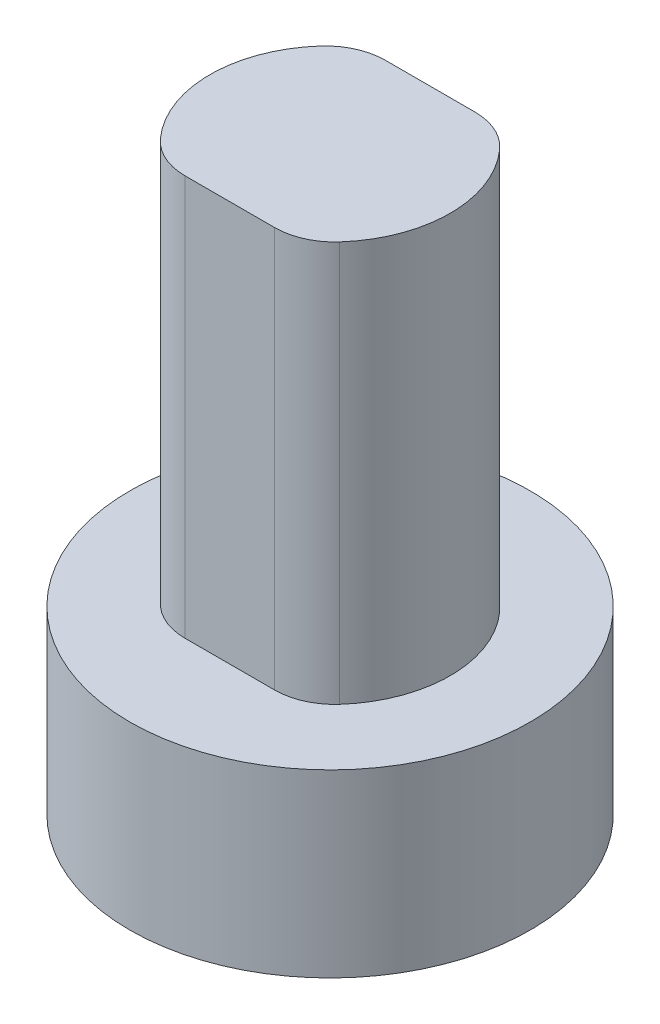
ISO-10303-21;
HEADER;
FILE_DESCRIPTION(('STEP AP214'),'2;1');
FILE_NAME('part.step','',(''),(''),'','','');
FILE_SCHEMA(('AUTOMOTIVE_DESIGN { 1 0 10303 214 1 1 1 1 }'));
ENDSEC;
DATA;
#1=APPLICATION_CONTEXT('core data for automotive mechanical design processes');
#2=APPLICATION_PROTOCOL_DEFINITION('international standard','automotive_design',2000,#1);
#3=PRODUCT_CONTEXT('',#1,'mechanical');
#4=PRODUCT('Part','Part','',(#3));
#5=PRODUCT_RELATED_PRODUCT_CATEGORY('part','',(#4));
#6=PRODUCT_DEFINITION_FORMATION('','',#4);
#7=PRODUCT_DEFINITION_CONTEXT('part definition',#1,'design');
#8=PRODUCT_DEFINITION('design','',#6,#7);
#9=PRODUCT_DEFINITION_SHAPE('','',#8);
#10=(LENGTH_UNIT() NAMED_UNIT(*) SI_UNIT(.MILLI.,.METRE.));
#11=(NAMED_UNIT(*) PLANE_ANGLE_UNIT() SI_UNIT($,.RADIAN.));
#12=(NAMED_UNIT(*) SI_UNIT($,.STERADIAN.) SOLID_ANGLE_UNIT());
#13=UNCERTAINTY_MEASURE_WITH_UNIT(LENGTH_MEASURE(1.E-05),#10,'distance_accuracy_value','');
#14=(GEOMETRIC_REPRESENTATION_CONTEXT(3) GLOBAL_UNCERTAINTY_ASSIGNED_CONTEXT((#13)) GLOBAL_UNIT_ASSIGNED_CONTEXT((#10,
#11,#12)) REPRESENTATION_CONTEXT('',''));
#15=CARTESIAN_POINT('',(0.,0.,0.));
#16=DIRECTION('',(0.,0.,1.));
#17=DIRECTION('',(1.,0.,0.));
#18=AXIS2_PLACEMENT_3D('',#15,#16,#17);
#19=CARTESIAN_POINT('',(0.,9.,0.));
#20=DIRECTION('',(0.,1.,0.));
#21=DIRECTION('',(0.,0.,1.));
#22=AXIS2_PLACEMENT_3D('',#19,#20,#21);
#23=PLANE('',#22);
#24=CARTESIAN_POINT('',(0.,9.,0.));
#25=DIRECTION('',(0.,1.,0.));
#26=DIRECTION('',(0.,0.,1.));
#27=AXIS2_PLACEMENT_3D('',#24,#25,#26);
#28=CIRCLE('',#27,10.);
#29=CARTESIAN_POINT('',(0.,9.,10.));
#30=VERTEX_POINT('',#29);
#31=EDGE_CURVE('E146',#30,#30,#28,.T.);
#32=ORIENTED_EDGE('',*,*,#31,.T.);
#33=EDGE_LOOP('',(#32));
#34=FACE_BOUND('',#33,.T.);
#35=DIRECTION('',(-1.,0.,0.));
#36=VECTOR('',#35,1.);
#37=CARTESIAN_POINT('',(-3.3166247903554,9.,-5.));
#38=LINE('',#37,#36);
#39=CARTESIAN_POINT('',(2.23606797749979,9.,-5.));
#40=VERTEX_POINT('',#39);
#41=CARTESIAN_POINT('',(-2.23606797749979,9.,-5.));
#42=VERTEX_POINT('',#41);
#43=EDGE_CURVE('E130',#40,#42,#38,.T.);
#44=ORIENTED_EDGE('',*,*,#43,.F.);
#45=CARTESIAN_POINT('',(2.23606797749979,9.,-2.));
#46=DIRECTION('',(0.,1.,0.));
#47=DIRECTION('',(0.,0.,1.));
#48=AXIS2_PLACEMENT_3D('',#45,#46,#47);
#49=CIRCLE('',#48,3.);
#50=CARTESIAN_POINT('',(4.47213595499957,9.,-4.00000000000001));
#51=VERTEX_POINT('',#50);
#52=EDGE_CURVE('E115',#40,#51,#49,.F.);
#53=ORIENTED_EDGE('',*,*,#52,.T.);
#54=CARTESIAN_POINT('',(0.,9.,0.));
#55=DIRECTION('',(0.,1.,0.));
#56=DIRECTION('',(0.,0.,1.));
#57=AXIS2_PLACEMENT_3D('',#54,#55,#56);
#58=CIRCLE('',#57,6.);
#59=CARTESIAN_POINT('',(4.47213595499958,9.,4.));
#60=VERTEX_POINT('',#59);
#61=EDGE_CURVE('E122',#60,#51,#58,.T.);
#62=ORIENTED_EDGE('',*,*,#61,.F.);
#63=CARTESIAN_POINT('',(2.23606797749979,9.,2.));
#64=DIRECTION('',(0.,1.,0.));
#65=DIRECTION('',(0.,0.,1.));
#66=AXIS2_PLACEMENT_3D('',#63,#64,#65);
#67=CIRCLE('',#66,3.);
#68=CARTESIAN_POINT('',(2.23606797749979,9.,5.));
#69=VERTEX_POINT('',#68);
#70=EDGE_CURVE('E107',#60,#69,#67,.F.);
#71=ORIENTED_EDGE('',*,*,#70,.T.);
#72=DIRECTION('',(1.,0.,0.));
#73=VECTOR('',#72,1.);
#74=CARTESIAN_POINT('',(-3.3166247903554,9.,5.));
#75=LINE('',#74,#73);
#76=CARTESIAN_POINT('',(-2.23606797749979,9.,5.));
#77=VERTEX_POINT('',#76);
#78=EDGE_CURVE('E144',#77,#69,#75,.T.);
#79=ORIENTED_EDGE('',*,*,#78,.F.);
#80=CARTESIAN_POINT('',(-2.23606797749979,9.,2.));
#81=DIRECTION('',(0.,1.,0.));
#82=DIRECTION('',(0.,0.,1.));
#83=AXIS2_PLACEMENT_3D('',#80,#81,#82);
#84=CIRCLE('',#83,3.);
#85=CARTESIAN_POINT('',(-4.47213595499958,9.,4.));
#86=VERTEX_POINT('',#85);
#87=EDGE_CURVE('E11',#77,#86,#84,.F.);
#88=ORIENTED_EDGE('',*,*,#87,.T.);
#89=CARTESIAN_POINT('',(0.,9.,0.));
#90=DIRECTION('',(0.,1.,0.));
#91=DIRECTION('',(0.,0.,1.));
#92=AXIS2_PLACEMENT_3D('',#89,#90,#91);
#93=CIRCLE('',#92,6.);
#94=CARTESIAN_POINT('',(-4.47213595499957,9.,-4.00000000000001));
#95=VERTEX_POINT('',#94);
#96=EDGE_CURVE('E134',#95,#86,#93,.T.);
#97=ORIENTED_EDGE('',*,*,#96,.F.);
#98=CARTESIAN_POINT('',(-2.23606797749979,9.,-2.));
#99=DIRECTION('',(0.,1.,0.));
#100=DIRECTION('',(0.,0.,1.));
#101=AXIS2_PLACEMENT_3D('',#98,#99,#100);
#102=CIRCLE('',#101,3.);
#103=EDGE_CURVE('E51',#95,#42,#102,.F.);
#104=ORIENTED_EDGE('',*,*,#103,.T.);
#105=EDGE_LOOP('',(#44,#53,#62,#71,#79,#88,#97,#104));
#106=FACE_BOUND('',#105,.T.);
#107=ADVANCED_FACE('F43',(#34,#106),#23,.T.);
#108=CARTESIAN_POINT('',(0.,9.,0.));
#109=DIRECTION('',(0.,-1.,0.));
#110=DIRECTION('',(0.,0.,-1.));
#111=AXIS2_PLACEMENT_3D('',#108,#109,#110);
#112=CYLINDRICAL_SURFACE('',#111,4.);
#113=CARTESIAN_POINT('',(-3.46410161513775,6.14999999999999,2.00000000000002));
#114=CARTESIAN_POINT('',(-3.41986579879663,6.14999078279336,2.07660487775859));
#115=CARTESIAN_POINT('',(-3.37299965625696,6.14284398565668,2.15185613729403));
#116=CARTESIAN_POINT('',(-3.2756394114654,6.1145088580631,2.29736837611792));
#117=CARTESIAN_POINT('',(-3.22513605350163,6.09328348897568,2.36761564936513));
#118=CARTESIAN_POINT('',(-3.12270964296426,6.0377051877981,2.50114755169935));
#119=CARTESIAN_POINT('',(-3.07079189796223,6.00339635664654,2.56445466122276));
#120=CARTESIAN_POINT('',(-2.96749181163747,5.92280524215057,2.68331913692991));
#121=CARTESIAN_POINT('',(-2.91610930744358,5.87652671882984,2.73887892834812));
#122=CARTESIAN_POINT('',(-2.81369813344845,5.77089324535595,2.84406987594854));
#123=CARTESIAN_POINT('',(-2.7627901301221,5.71104232975102,2.89332021172385));
#124=CARTESIAN_POINT('',(-2.66623399573283,5.58101116034102,2.98253692146532));
#125=CARTESIAN_POINT('',(-2.62058858804746,5.51082560078819,3.02249849929904));
#126=CARTESIAN_POINT('',(-2.53502124294832,5.35803175112829,3.09466544266842));
#127=CARTESIAN_POINT('',(-2.4954791863114,5.27498888469347,3.12640645323986));
#128=CARTESIAN_POINT('',(-2.42771410140088,5.10126369070982,3.17931855192998));
#129=CARTESIAN_POINT('',(-2.39948535779936,5.01058524863699,3.2004949784562));
#130=CARTESIAN_POINT('',(-2.35777137416715,4.82865200299817,3.23134062474345));
#131=CARTESIAN_POINT('',(-2.34364982649109,4.73762892785693,3.24150840743216));
#132=CARTESIAN_POINT('',(-2.32915276747332,4.55395349263472,3.25194336406059));
#133=CARTESIAN_POINT('',(-2.32876988937403,4.4613020323707,3.25221584392238));
#134=CARTESIAN_POINT('',(-2.34127085997963,4.28440111338128,3.24322268782688));
#135=CARTESIAN_POINT('',(-2.35316385250681,4.20004184125084,3.23466944374448));
#136=CARTESIAN_POINT('',(-2.38777450291636,4.03488971561883,3.20920388896808));
#137=CARTESIAN_POINT('',(-2.41049418582588,3.9540975323967,3.19229001447737));
#138=CARTESIAN_POINT('',(-2.46576462176865,3.79635489124138,3.14979956521945));
#139=CARTESIAN_POINT('',(-2.49851244931055,3.71952126219167,3.12404795813458));
#140=CARTESIAN_POINT('',(-2.57167348694841,3.57313976753997,3.06410318486565));
#141=CARTESIAN_POINT('',(-2.61208968434862,3.50359475775085,3.02990672731933));
#142=CARTESIAN_POINT('',(-2.7021117274384,3.36771359221219,2.95000004827088));
#143=CARTESIAN_POINT('',(-2.75220106997113,3.30211804229675,2.90357167923836));
#144=CARTESIAN_POINT('',(-2.85637418952379,3.18255532555863,2.80115299046348));
#145=CARTESIAN_POINT('',(-2.91045886197079,3.12859077613916,2.74516052351808));
#146=CARTESIAN_POINT('',(-3.02127509160419,3.03276522641497,2.62275668313397));
#147=CARTESIAN_POINT('',(-3.07803875785097,2.99119971680583,2.55614149807174));
#148=CARTESIAN_POINT('',(-3.19029806000538,2.92339697589113,2.41456806511437));
#149=CARTESIAN_POINT('',(-3.24579436667455,2.89715144678884,2.33961435987391));
#150=CARTESIAN_POINT('',(-3.34961545656668,2.86227049632178,2.18814485616719));
#151=CARTESIAN_POINT('',(-3.39817161045137,2.85264082206407,2.11201654078637));
#152=CARTESIAN_POINT('',(-3.49012935698804,2.84830795623671,1.95631355724471));
#153=CARTESIAN_POINT('',(-3.53353238880627,2.85360058689179,1.87673985982418));
#154=CARTESIAN_POINT('',(-3.61202472838756,2.87824526824296,1.72062459391451));
#155=CARTESIAN_POINT('',(-3.64741485096263,2.8969040733401,1.64412279562767));
#156=CARTESIAN_POINT('',(-3.71198722914717,2.94679209633711,1.49262727813211));
#157=CARTESIAN_POINT('',(-3.7411686960656,2.9780229098148,1.41763375161482));
#158=CARTESIAN_POINT('',(-3.79419463304067,3.0531893799809,1.2690566994377));
#159=CARTESIAN_POINT('',(-3.81784581997321,3.09748856175622,1.19558877695907));
#160=CARTESIAN_POINT('',(-3.85914654823158,3.19713393425787,1.05469746835982));
#161=CARTESIAN_POINT('',(-3.87679359850551,3.25248469508984,0.987276599618655));
#162=CARTESIAN_POINT('',(-3.90794778294037,3.37720430481198,0.856041803511947));
#163=CARTESIAN_POINT('',(-3.92107799483967,3.4472838240393,0.792812022374044));
#164=CARTESIAN_POINT('',(-3.94256135106235,3.59707129060853,0.677962006819241));
#165=CARTESIAN_POINT('',(-3.9509134900716,3.67678125994256,0.626344216968913));
#166=CARTESIAN_POINT('',(-3.96411998309715,3.84509537053332,0.536516788773526));
#167=CARTESIAN_POINT('',(-3.9689273176559,3.93380191600806,0.498490722761851));
#168=CARTESIAN_POINT('',(-3.97594014408172,4.11670916597824,0.439102465961379));
#169=CARTESIAN_POINT('',(-3.9781477244514,4.21090539641817,0.417726903734387));
#170=CARTESIAN_POINT('',(-3.980558182704,4.39443027315807,0.394062172377436));
#171=CARTESIAN_POINT('',(-3.9809002345802,4.48358721945794,0.390450005474714));
#172=CARTESIAN_POINT('',(-3.98005606045025,4.66112847075918,0.398964251105821));
#173=CARTESIAN_POINT('',(-3.97887005808461,4.74951288691937,0.411088360536875));
#174=CARTESIAN_POINT('',(-3.97471839032054,4.9189330712577,0.449395610560455));
#175=CARTESIAN_POINT('',(-3.97183468828181,5.00012071142211,0.474925744636432));
#176=CARTESIAN_POINT('',(-3.9637440392635,5.15741452247408,0.538282159929028));
#177=CARTESIAN_POINT('',(-3.95853644205234,5.23351926429761,0.576111881795847));
#178=CARTESIAN_POINT('',(-3.94460266179337,5.3834220382414,0.665015952005671));
#179=CARTESIAN_POINT('',(-3.93568573257192,5.45681407102141,0.716743905641566));
#180=CARTESIAN_POINT('',(-3.91333063770712,5.59467168726428,0.830169801409556));
#181=CARTESIAN_POINT('',(-3.89989095374381,5.65913426277442,0.891871088038615));
#182=CARTESIAN_POINT('',(-3.86635510049326,5.78199413870367,1.02787996610638));
#183=CARTESIAN_POINT('',(-3.84585512474442,5.83963922360552,1.10277071257805));
#184=CARTESIAN_POINT('',(-3.79754008885842,5.94154015953871,1.25911616042918));
#185=CARTESIAN_POINT('',(-3.76972169365395,5.98578988636589,1.34057384265037));
#186=CARTESIAN_POINT('',(-3.7068153441715,6.05866373983474,1.50572131750158));
#187=CARTESIAN_POINT('',(-3.6718600086225,6.08754242535854,1.58934901522178));
#188=CARTESIAN_POINT('',(-3.59463845473543,6.12951108478514,1.75699233706686));
#189=CARTESIAN_POINT('',(-3.5523956895743,6.14265066624544,1.84100590006016));
#190=CARTESIAN_POINT('',(-3.49304832013999,6.14922677033003,1.94922672876118));
#191=CARTESIAN_POINT('',(-3.47871856452039,6.15000304566421,1.97468726219438));
#192=CARTESIAN_POINT('',(-3.46410161513775,6.14999999999999,2.00000000000002));
#193=B_SPLINE_CURVE_WITH_KNOTS('',3,(#113,#114,#115,#116,#117,#118,#119,#120,#121,#122,#123,
#124,#125,#126,#127,#128,#129,#130,#131,#132,#133,#134,#135,#136,#137,#138,#139,#140,#141,#142,
#143,#144,#145,#146,#147,#148,#149,#150,#151,#152,#153,#154,#155,#156,#157,#158,#159,#160,#161,
#162,#163,#164,#165,#166,#167,#168,#169,#170,#171,#172,#173,#174,#175,#176,#177,#178,#179,#180,
#181,#182,#183,#184,#185,#186,#187,#188,#189,#190,#191,#192),.UNSPECIFIED.,.T.,.F.,(4,2,2,2,2,2,
2,2,2,2,2,2,2,2,2,2,2,2,2,2,2,2,2,2,2,2,2,2,2,2,2,2,2,2,2,2,2,2,2,4),(0.,0.265297098770619,
0.531294937906658,0.796403981498878,1.06142984766523,1.33841878994456,1.61555043582129,
1.90598404924537,2.19627075414924,2.4727764853942,2.74913395037959,3.00480633611682,
3.2605265616686,3.5216353930134,3.78284615202014,4.06565185095455,4.34852112528508,
4.63767392136374,4.92666995726766,5.19768149557684,5.46861716672803,5.72643264660552,
5.98428085748383,6.25011488704504,6.5160590741843,6.800645802504,7.08529238632156,
7.37364985225779,7.66177550895674,7.92807823226722,8.19434198489783,8.44869772098557,
8.70312467109943,8.97267479984707,9.24231550885211,9.53104085816539,9.81989801073176,
10.1038095613048,10.3868238858898,10.4744866574818),.UNSPECIFIED.);
#194=CARTESIAN_POINT('',(-3.46410161513775,6.14999999999999,2.00000000000002));
#195=VERTEX_POINT('',#194);
#196=EDGE_CURVE('E395',#195,#195,#193,.T.);
#197=ORIENTED_EDGE('',*,*,#196,.F.);
#198=EDGE_LOOP('',(#197));
#199=FACE_BOUND('',#198,.T.);
#200=CARTESIAN_POINT('',(0.,6.14999999999999,-4.));
#201=CARTESIAN_POINT('',(-0.0884596783632785,6.14999078279336,-3.99999309817074));
#202=CARTESIAN_POINT('',(-0.177062252057582,6.14284398565668,-3.99703145792172));
#203=CARTESIAN_POINT('',(-0.351759669836408,6.1145088580631,-3.9854711320255));
#204=CARTESIAN_POINT('',(-0.437847271996959,6.09328348897568,-3.97685757767606));
#205=CARTESIAN_POINT('',(-0.604702496902739,6.0377051877981,-3.95491965529936));
#206=CARTESIAN_POINT('',(-0.685486934491194,6.00339635664654,-3.94161112398211));
#207=CARTESIAN_POINT('',(-0.840076633223484,5.92280524215057,-3.91158286286531));
#208=CARTESIAN_POINT('',(-0.913884076117563,5.87652671882984,-3.89486420463244));
#209=CARTESIAN_POINT('',(-1.05618769598525,5.77089324535595,-3.85876900012149));
#210=CARTESIAN_POINT('',(-1.12429373957476,5.71104232975102,-3.83930654387258));
#211=CARTESIAN_POINT('',(-1.24983574384757,5.58101116034102,-3.80029483347099));
#212=CARTESIAN_POINT('',(-1.30726618926957,5.51082560078819,-3.78074553976622));
#213=CARTESIAN_POINT('',(-1.41254826809049,5.35803175112829,-3.74272551686067));
#214=CARTESIAN_POINT('',(-1.45980781790561,5.27498888469347,-3.72435159658093));
#215=CARTESIAN_POINT('',(-1.53951358199406,5.10126369070982,-3.69212136090387));
#216=CARTESIAN_POINT('',(-1.5719672771279,5.01058524863699,-3.67826276509115));
#217=CARTESIAN_POINT('',(-1.61953738222491,4.82865200299817,-3.65756021871623));
#218=CARTESIAN_POINT('',(-1.63540371417153,4.73762892785693,-3.65041449103237));
#219=CARTESIAN_POINT('',(-1.65168918120802,4.55395349263472,-3.64307714795703));
#220=CARTESIAN_POINT('',(-1.65211659474,4.4613020323707,-3.64288180572738));
#221=CARTESIAN_POINT('',(-1.6380778077983,4.28440111338128,-3.64921138579605));
#222=CARTESIAN_POINT('',(-1.62472398487458,4.20004184125084,-3.6552343974104));
#223=CARTESIAN_POINT('',(-1.58536484231197,4.03488971561883,-3.67247532251837));
#224=CARTESIAN_POINT('',(-1.55935715587184,3.9540975323967,-3.68369420783859));
#225=CARTESIAN_POINT('',(-1.49492412942488,3.79635489124138,-3.71031458481431));
#226=CARTESIAN_POINT('',(-1.45624866973016,3.71952126219167,-3.72579923184191));
#227=CARTESIAN_POINT('',(-1.36775445443624,3.57313976753997,-3.75918616236907));
#228=CARTESIAN_POINT('',(-1.31793135478158,3.50359475775085,-3.77708938726885));
#229=CARTESIAN_POINT('',(-1.20371911924869,3.36771359221219,-3.81509742396095));
#230=CARTESIAN_POINT('',(-1.13846630094388,3.30211804229675,-3.8352618825369));
#231=CARTESIAN_POINT('',(-0.997682554866211,3.18255532555863,-3.87426910607353));
#232=CARTESIAN_POINT('',(-0.92214931984743,3.12859077613916,-3.8931115728953));
#233=CARTESIAN_POINT('',(-0.760736369737321,3.03276522641497,-3.92787932271737));
#234=CARTESIAN_POINT('',(-0.674664094072233,2.99119971680583,-3.94373050716791));
#235=CARTESIAN_POINT('',(-0.495928253552974,2.92339697589113,-3.97016319816606));
#236=CARTESIAN_POINT('',(-0.403268287372383,2.89715144678884,-3.98074755693754));
#237=CARTESIAN_POINT('',(-0.220181304317672,2.86227049632178,-3.99492450637935));
#238=CARTESIAN_POINT('',(-0.12997417230822,2.85264082206407,-3.99891121146315));
#239=CARTESIAN_POINT('',(0.050847440152223,2.84830795623671,-4.00069746426785));
#240=CARTESIAN_POINT('',(0.141461799500567,2.85360058689179,-3.99849874371343));
#241=CARTESIAN_POINT('',(0.315907755487548,2.87824526824296,-3.98841747083847));
#242=CARTESIAN_POINT('',(0.399855317526685,2.8969040733401,-3.9808153168881));
#243=CARTESIAN_POINT('',(0.563340473329574,2.94679209633711,-3.96098887803091));
#244=CARTESIAN_POINT('',(0.642877505872145,2.9780229098148,-3.94876400644332));
#245=CARTESIAN_POINT('',(0.798061975964473,3.0531893799809,-3.92039728883464));
#246=CARTESIAN_POINT('',(0.873512656660505,3.09748856175622,-3.90414585630856));
#247=CARTESIAN_POINT('',(1.01617847320907,3.19713393425787,-3.86946768187548));
#248=CARTESIAN_POINT('',(1.0833901834211,3.25248469508984,-3.85104004134398));
#249=CARTESIAN_POINT('',(1.21261994292741,3.37720430481198,-3.8124029584454));
#250=CARTESIAN_POINT('',(1.27394364561822,3.4472838240393,-3.79215916493832));
#251=CARTESIAN_POINT('',(1.38414835482505,3.59707129060853,-3.75333928940831));
#252=CARTESIAN_POINT('',(1.43302674162727,3.67678125994256,-3.73476355904109));
#253=CARTESIAN_POINT('',(1.51742282291387,3.84509537053332,-3.70128700339843));
#254=CARTESIAN_POINT('',(1.55275802936534,3.93380191600806,-3.68643724424496));
#255=CARTESIAN_POINT('',(1.60769618165393,4.11670916597824,-3.66281640168181));
#256=CARTESIAN_POINT('',(1.62731175174752,4.21090539641817,-3.65404044124936));
#257=CARTESIAN_POINT('',(1.64901123940267,4.39443027315807,-3.64429559365239));
#258=CARTESIAN_POINT('',(1.65231049364124,4.48358721945794,-3.64278573581524));
#259=CARTESIAN_POINT('',(1.64451485356567,4.66112847075918,-3.64631178238903));
#260=CARTESIAN_POINT('',(1.63342206561729,4.74951288691937,-3.65134672892697));
#261=CARTESIAN_POINT('',(1.59817118006571,4.9189330712577,-3.666904904187));
#262=CARTESIAN_POINT('',(1.57461958437453,5.00012071142211,-3.67717261200251));
#263=CARTESIAN_POINT('',(1.51570599472927,5.15741452247408,-3.70184411206584));
#264=CARTESIAN_POINT('',(1.48034069596892,5.23351926429761,-3.71624906152171));
#265=CARTESIAN_POINT('',(1.3963806225379,5.3834220382414,-3.7486340889516));
#266=CARTESIAN_POINT('',(1.34712443599271,5.45681407102141,-3.76677577854003));
#267=CARTESIAN_POINT('',(1.23771718137822,5.59467168726428,-3.80412864636709));
#268=CARTESIAN_POINT('',(1.17756245772962,5.65913426277442,-3.82334018195057));
#269=CARTESIAN_POINT('',(1.04300738755743,5.78199413870367,-3.86230172013188));
#270=CARTESIAN_POINT('',(0.967900110730174,5.83963922360552,-3.88199359359226));
#271=CARTESIAN_POINT('',(0.808343463182031,5.94154015953871,-3.91832426905579));
#272=CARTESIAN_POINT('',(0.723889843442848,5.98578988636589,-3.9349616732268));
#273=CARTESIAN_POINT('',(0.549414760109626,6.05866373983474,-3.96305691394126));
#274=CARTESIAN_POINT('',(0.459513381649423,6.08754242535854,-3.97459855421812));
#275=CARTESIAN_POINT('',(0.27571922921324,6.12951108478514,-3.99154438775475));
#276=CARTESIAN_POINT('',(0.181839966818029,6.14265066624544,-3.99696786149576));
#277=CARTESIAN_POINT('',(0.0584442952271959,6.14922677033003,-3.99968194626838));
#278=CARTESIAN_POINT('',(0.0292299486703378,6.15000304566421,-4.00000228058838));
#279=CARTESIAN_POINT('',(0.,6.14999999999999,-4.));
#280=B_SPLINE_CURVE_WITH_KNOTS('',3,(#200,#201,#202,#203,#204,#205,#206,#207,#208,#209,#210,
#211,#212,#213,#214,#215,#216,#217,#218,#219,#220,#221,#222,#223,#224,#225,#226,#227,#228,#229,
#230,#231,#232,#233,#234,#235,#236,#237,#238,#239,#240,#241,#242,#243,#244,#245,#246,#247,#248,
#249,#250,#251,#252,#253,#254,#255,#256,#257,#258,#259,#260,#261,#262,#263,#264,#265,#266,#267,
#268,#269,#270,#271,#272,#273,#274,#275,#276,#277,#278,#279),.UNSPECIFIED.,.T.,.F.,(4,2,2,2,2,2,
2,2,2,2,2,2,2,2,2,2,2,2,2,2,2,2,2,2,2,2,2,2,2,2,2,2,2,2,2,2,2,2,2,4),(0.,0.265297098770619,
0.531294937906658,0.796403981498878,1.06142984766523,1.33841878994456,1.61555043582129,
1.90598404924537,2.19627075414924,2.4727764853942,2.74913395037959,3.00480633611682,
3.2605265616686,3.5216353930134,3.78284615202014,4.06565185095455,4.34852112528508,
4.63767392136374,4.92666995726766,5.19768149557684,5.46861716672804,5.72643264660553,
5.98428085748383,6.25011488704504,6.51605907418431,6.800645802504,7.08529238632156,
7.37364985225779,7.66177550895674,7.92807823226722,8.19434198489783,8.44869772098557,
8.70312467109943,8.97267479984707,9.24231550885211,9.53104085816539,9.81989801073176,
10.1038095613048,10.3868238858898,10.4744866574818),.UNSPECIFIED.);
#281=CARTESIAN_POINT('',(0.,6.14999999999999,-4.));
#282=VERTEX_POINT('',#281);
#283=EDGE_CURVE('E203',#282,#282,#280,.T.);
#284=ORIENTED_EDGE('',*,*,#283,.F.);
#285=EDGE_LOOP('',(#284));
#286=FACE_BOUND('',#285,.T.);
#287=CARTESIAN_POINT('',(0.,0.,0.));
#288=DIRECTION('',(0.,1.,0.));
#289=DIRECTION('',(0.,0.,1.));
#290=AXIS2_PLACEMENT_3D('',#287,#288,#289);
#291=CIRCLE('',#290,4.);
#292=CARTESIAN_POINT('',(0.,0.,4.));
#293=VERTEX_POINT('',#292);
#294=EDGE_CURVE('E150',#293,#293,#291,.T.);
#295=ORIENTED_EDGE('',*,*,#294,.F.);
#296=EDGE_LOOP('',(#295));
#297=FACE_BOUND('',#296,.T.);
#298=CARTESIAN_POINT('',(0.,22.,0.));
#299=DIRECTION('',(0.,-1.,0.));
#300=DIRECTION('',(0.,0.,-1.));
#301=AXIS2_PLACEMENT_3D('',#298,#299,#300);
#302=CIRCLE('',#301,4.);
#303=CARTESIAN_POINT('',(0.,22.,-4.));
#304=VERTEX_POINT('',#303);
#305=EDGE_CURVE('E131',#304,#304,#302,.T.);
#306=ORIENTED_EDGE('',*,*,#305,.F.);
#307=EDGE_LOOP('',(#306));
#308=FACE_BOUND('',#307,.T.);
#309=ADVANCED_FACE('F242',(#199,#286,#297,#308),#112,.F.);
#310=CARTESIAN_POINT('',(0.,9.,0.));
#311=DIRECTION('',(0.,-1.,0.));
#312=DIRECTION('',(0.,0.,-1.));
#313=AXIS2_PLACEMENT_3D('',#310,#311,#312);
#314=CYLINDRICAL_SURFACE('',#313,10.);
#315=CARTESIAN_POINT('',(-8.66025403784437,6.14999999999999,5.00000000000004));
#316=CARTESIAN_POINT('',(-8.61424695386681,6.14999629901469,5.07968347211924));
#317=CARTESIAN_POINT('',(-8.56710606814318,6.14227754131458,5.1587707114546));
#318=CARTESIAN_POINT('',(-8.47201395303659,6.11161876486206,5.31349690083578));
#319=CARTESIAN_POINT('',(-8.42406201394487,6.08866466304119,5.38913259117967));
#320=CARTESIAN_POINT('',(-8.32903466381875,6.02824636106408,5.53486629689461));
#321=CARTESIAN_POINT('',(-8.28195857385746,5.99079393643969,5.6049687508722));
#322=CARTESIAN_POINT('',(-8.19035610806164,5.90247274585137,5.7379959858219));
#323=CARTESIAN_POINT('',(-8.14582943486076,5.85160554849499,5.80092160475954));
#324=CARTESIAN_POINT('',(-8.06066709842184,5.73739122286708,5.91869744297817));
#325=CARTESIAN_POINT('',(-8.02006722794648,5.67394293638174,5.9734754548659));
#326=CARTESIAN_POINT('',(-7.94485974114897,5.53658522640677,6.07314676378825));
#327=CARTESIAN_POINT('',(-7.91025249949389,5.46267514935681,6.11803944282642));
#328=CARTESIAN_POINT('',(-7.8483619498806,5.30594065632332,6.19723850124928));
#329=CARTESIAN_POINT('',(-7.82112403335192,5.22306520565612,6.23147945637892));
#330=CARTESIAN_POINT('',(-7.77553550878447,5.05109737476351,6.28827338214783));
#331=CARTESIAN_POINT('',(-7.75718431268401,4.96200540635072,6.31082712617282));
#332=CARTESIAN_POINT('',(-7.73039975184367,4.78098541799901,6.34360845183638));
#333=CARTESIAN_POINT('',(-7.7218783856889,4.68909024432124,6.35394542478533));
#334=CARTESIAN_POINT('',(-7.7148863910566,4.50436263407657,6.36243351148473));
#335=CARTESIAN_POINT('',(-7.71641506540515,4.41153026296937,6.36058547051272));
#336=CARTESIAN_POINT('',(-7.72937692560644,4.22855272294329,6.34482715005175));
#337=CARTESIAN_POINT('',(-7.74070995493516,4.13838988597263,6.33103884508822));
#338=CARTESIAN_POINT('',(-7.77258858284567,3.96231592946661,6.29185973216237));
#339=CARTESIAN_POINT('',(-7.79313449165143,3.87640495321172,6.26646853349691));
#340=CARTESIAN_POINT('',(-7.84258683961042,3.71080647007558,6.20446641181719));
#341=CARTESIAN_POINT('',(-7.87153223493753,3.63115021075932,6.16780316164587));
#342=CARTESIAN_POINT('',(-7.93644263196013,3.48066567609225,6.08405100871078));
#343=CARTESIAN_POINT('',(-7.97240818916525,3.40983810008771,6.03696128085391));
#344=CARTESIAN_POINT('',(-8.05030562006915,3.27812002111733,5.93269379206283));
#345=CARTESIAN_POINT('',(-8.0923046297711,3.21736060537005,5.8754004927947));
#346=CARTESIAN_POINT('',(-8.18021275810458,3.10853397839374,5.75237564300237));
#347=CARTESIAN_POINT('',(-8.22612190100619,3.06046684595291,5.6866440401006));
#348=CARTESIAN_POINT('',(-8.32011333395339,2.97837784946569,5.54821686425202));
#349=CARTESIAN_POINT('',(-8.36819735691171,2.94436741236198,5.47551568451769));
#350=CARTESIAN_POINT('',(-8.46474631441262,2.89147808722467,5.3250401975006));
#351=CARTESIAN_POINT('',(-8.51321121740284,2.87259795885522,5.24726630662834));
#352=CARTESIAN_POINT('',(-8.60833497911074,2.85068253883883,5.08968957967395));
#353=CARTESIAN_POINT('',(-8.65500820971007,2.84746726387847,5.00992042763085));
#354=CARTESIAN_POINT('',(-8.74574789381547,2.85649319868027,4.84977972124075));
#355=CARTESIAN_POINT('',(-8.78981444549316,2.86873382596048,4.7694081897089));
#356=CARTESIAN_POINT('',(-8.87397530500753,2.9081744027771,4.6109186630234));
#357=CARTESIAN_POINT('',(-8.91409157726081,2.93528539430836,4.53279014626832));
#358=CARTESIAN_POINT('',(-8.98984372557428,3.00360239255508,4.38063235433321));
#359=CARTESIAN_POINT('',(-9.02547935405787,3.04480917766169,4.3066033057944));
#360=CARTESIAN_POINT('',(-9.09202712145392,3.14056131949899,4.16428565038655));
#361=CARTESIAN_POINT('',(-9.12289560289641,3.1952192859171,4.0960524121839));
#362=CARTESIAN_POINT('',(-9.17922882761276,3.31616714906879,3.96820461092356));
#363=CARTESIAN_POINT('',(-9.20469318638615,3.3824578728543,3.9085906612198));
#364=CARTESIAN_POINT('',(-9.25031265179175,3.5255961063283,3.79937664923304));
#365=CARTESIAN_POINT('',(-9.2704112883987,3.60254387109881,3.74988428802291));
#366=CARTESIAN_POINT('',(-9.30492355939143,3.76434104706747,3.66341020907198));
#367=CARTESIAN_POINT('',(-9.31933737136509,3.84919021133191,3.62642810052931));
#368=CARTESIAN_POINT('',(-9.3424530943708,4.02403953240315,3.56645564462377));
#369=CARTESIAN_POINT('',(-9.35117822401892,4.11401709979667,3.5434084496404));
#370=CARTESIAN_POINT('',(-9.36303806471151,4.29685131178056,3.51195183314056));
#371=CARTESIAN_POINT('',(-9.36617325117034,4.38970771084816,3.50354116681578));
#372=CARTESIAN_POINT('',(-9.36686338370776,4.57445064130181,3.50169533620379));
#373=CARTESIAN_POINT('',(-9.36448604444843,4.66633516019211,3.50807844790536));
#374=CARTESIAN_POINT('',(-9.35428138890246,4.84764775186387,3.53519818966865));
#375=CARTESIAN_POINT('',(-9.34645408927591,4.93707583215359,3.55593477585291));
#376=CARTESIAN_POINT('',(-9.32533549537295,5.11086524243541,3.61095253477269));
#377=CARTESIAN_POINT('',(-9.31205029955106,5.19523210745096,3.64521858851578));
#378=CARTESIAN_POINT('',(-9.2799939798782,5.35670626686032,3.72606959755306));
#379=CARTESIAN_POINT('',(-9.26122259282943,5.43381321272772,3.77265514385972));
#380=CARTESIAN_POINT('',(-9.21795981973421,5.57954549763769,3.87716953281877));
#381=CARTESIAN_POINT('',(-9.19340444570303,5.64806175981956,3.93522400350808));
#382=CARTESIAN_POINT('',(-9.1388012966813,5.77369059987675,4.06041434589588));
#383=CARTESIAN_POINT('',(-9.10875225470475,5.83080054078023,4.12755231155955));
#384=CARTESIAN_POINT('',(-9.04322158787421,5.93234742257348,4.26922360669501));
#385=CARTESIAN_POINT('',(-9.00770463577451,5.97669614797802,4.34380383000343));
#386=CARTESIAN_POINT('',(-8.93192368833484,6.0508633528063,4.49756120342767));
#387=CARTESIAN_POINT('',(-8.8916644909017,6.08069636412524,4.57673366691874));
#388=CARTESIAN_POINT('',(-8.81962327438732,6.11847934152684,4.71363641426027));
#389=CARTESIAN_POINT('',(-8.78881655486917,6.13028074881449,4.77084759023067));
#390=CARTESIAN_POINT('',(-8.72561868388335,6.1460423389331,4.8854746013535));
#391=CARTESIAN_POINT('',(-8.69322755884517,6.15000265251578,4.94289043307725));
#392=CARTESIAN_POINT('',(-8.66025403784437,6.14999999999999,5.00000000000004));
#393=B_SPLINE_CURVE_WITH_KNOTS('',3,(#315,#316,#317,#318,#319,#320,#321,#322,#323,#324,#325,
#326,#327,#328,#329,#330,#331,#332,#333,#334,#335,#336,#337,#338,#339,#340,#341,#342,#343,#344,
#345,#346,#347,#348,#349,#350,#351,#352,#353,#354,#355,#356,#357,#358,#359,#360,#361,#362,#363,
#364,#365,#366,#367,#368,#369,#370,#371,#372,#373,#374,#375,#376,#377,#378,#379,#380,#381,#382,
#383,#384,#385,#386,#387,#388,#389,#390,#391,#392),.UNSPECIFIED.,.T.,.F.,(4,2,2,2,2,2,2,2,2,2,2,
2,2,2,2,2,2,2,2,2,2,2,2,2,2,2,2,2,2,2,2,2,2,2,2,2,2,2,4),(0.,0.275793319008917,
0.551841928312972,0.827666799870597,1.1034594331417,1.38156673144315,1.65969141110741,
1.93949209608633,2.21927426326044,2.49653175525206,2.77377001402269,3.04820914252876,
3.32265751287871,3.59839967320042,3.87416366201706,4.1532757240192,4.43238951858747,
4.71172976565332,4.991047110928,5.26714751096616,5.54323750600189,5.81769359979004,
6.09216485190803,6.36901711215385,6.64588906369257,6.92556925596458,7.20524071063227,
7.48376340648032,7.76226241335696,8.03735855216244,8.31245385002402,8.58724259883658,
8.86204453269316,9.14004258759616,9.41810483731131,9.69804546871317,9.97770526783281,
10.1753710978727,10.3730336317698),.UNSPECIFIED.);
#394=CARTESIAN_POINT('',(-8.66025403784437,6.14999999999999,5.00000000000004));
#395=VERTEX_POINT('',#394);
#396=EDGE_CURVE('E399',#395,#395,#393,.T.);
#397=ORIENTED_EDGE('',*,*,#396,.T.);
#398=EDGE_LOOP('',(#397));
#399=FACE_BOUND('',#398,.T.);
#400=CARTESIAN_POINT('',(0.,6.14999999999999,-10.));
#401=CARTESIAN_POINT('',(-0.0920114531057511,6.14999629901469,-9.99999843258099));
#402=CARTESIAN_POINT('',(-0.184073454347172,6.14227754131458,-9.99871684765511));
#403=CARTESIAN_POINT('',(-0.365616322535328,6.11161876486206,-9.99372775496381));
#404=CARTESIAN_POINT('',(-0.455094721351767,6.08866466304119,-9.99001800272159));
#405=CARTESIAN_POINT('',(-0.628817487751613,6.02824636106408,-9.98058875631552));
#406=CARTESIAN_POINT('',(-0.713066038744483,5.99079393643969,-9.974870893487));
#407=CARTESIAN_POINT('',(-0.874072236504039,5.90247274585137,-9.96205444853338));
#408=CARTESIAN_POINT('',(-0.950830757653325,5.85160554849499,-9.95495602786423));
#409=CARTESIAN_POINT('',(-1.09540879372212,5.73739122286708,-9.9400912001718));
#410=CARTESIAN_POINT('',(-1.16314787882339,5.67394293638174,-9.93231968689365));
#411=CARTESIAN_POINT('',(-1.28706950777735,5.53658522640677,-9.9170237472334));
#412=CARTESIAN_POINT('',(-1.34325132909588,5.46267514935681,-9.90949933632427));
#413=CARTESIAN_POINT('',(-1.44278500045253,5.30594065632332,-9.89550007731641));
#414=CARTESIAN_POINT('',(-1.48605749570898,5.22306520565612,-9.88903182722124));
#415=CARTESIAN_POINT('',(-1.55803674048924,5.05109737476351,-9.87794796970923));
#416=CARTESIAN_POINT('',(-1.58674445381555,4.96200540635072,-9.8733322397089));
#417=CARTESIAN_POINT('',(-1.62852619503009,4.78098541799901,-9.86652679242373));
#418=CARTESIAN_POINT('',(-1.64173895927951,4.68909024432124,-9.86431555933323));
#419=CARTESIAN_POINT('',(-1.65258585530686,4.50436263407657,-9.86250435770823));
#420=CARTESIAN_POINT('',(-1.65022106770359,4.41153026296937,-9.86290420804218));
#421=CARTESIAN_POINT('',(-1.63009303176277,4.22855272294329,-9.86625034802632));
#422=CARTESIAN_POINT('',(-1.61248549472487,4.13838988597263,-9.86917088684506));
#423=CARTESIAN_POINT('',(-1.56261607367809,3.9623159294666,-9.87718903199043));
#424=CARTESIAN_POINT('',(-1.53035369619838,3.87640495321172,-9.88228671162733));
#425=CARTESIAN_POINT('',(-1.45193210975571,3.71080647007558,-9.89411264039674));
#426=CARTESIAN_POINT('',(-1.4057081060585,3.63115021075932,-9.90084846298694));
#427=CARTESIAN_POINT('',(-1.30072141548377,3.48066567609225,-9.9151864393107));
#428=CARTESIAN_POINT('',(-1.24195773629986,3.40983810008771,-9.92278866158316));
#429=CARTESIAN_POINT('',(-1.11271072676602,3.27812002111733,-9.93811607123993));
#430=CARTESIAN_POINT('',(-1.04209376928222,3.21736060537005,-9.94584163094155));
#431=CARTESIAN_POINT('',(-0.891597059898563,3.10853397839374,-9.96045987838133));
#432=CARTESIAN_POINT('',(-0.811717250503355,3.06046684595291,-9.9673525609492));
#433=CARTESIAN_POINT('',(-0.644840083170752,2.97837784946569,-9.97953794169528));
#434=CARTESIAN_POINT('',(-0.557837003156558,2.94436741236198,-9.98482933722619));
#435=CARTESIAN_POINT('',(-0.37924693000247,2.89147808722467,-9.99320544362233));
#436=CARTESIAN_POINT('',(-0.287660313260821,2.87259795885522,-9.99629033536768));
#437=CARTESIAN_POINT('',(-0.103632983819161,2.85068253883883,-9.99988156603306));
#438=CARTESIAN_POINT('',(-0.0112142564118354,2.84746726387847,-10.0004171933872));
#439=CARTESIAN_POINT('',(0.172841505554681,2.85649319868027,-9.99892971175882));
#440=CARTESIAN_POINT('',(0.264478569441163,2.86873382596048,-9.99690669920295));
#441=CARTESIAN_POINT('',(0.443814955541768,2.9081744027771,-9.99054737820398));
#442=CARTESIAN_POINT('',(0.5315343719383,2.93528539430836,-9.98622483070291));
#443=CARTESIAN_POINT('',(0.70118295929459,3.00360239255508,-9.97574921956607));
#444=CARTESIAN_POINT('',(0.783111810188987,3.04480917766169,-9.96959605484327));
#445=CARTESIAN_POINT('',(0.939636398877248,3.14056131949899,-9.95606928426946));
#446=CARTESIAN_POINT('',(1.01416235726447,3.1952192859171,-9.94868555427359));
#447=CARTESIAN_POINT('',(1.15304841333208,3.31616714906879,-9.93354765732487));
#448=CARTESIAN_POINT('',(1.21740778758216,3.3824578728543,-9.92579346406183));
#449=CARTESIAN_POINT('',(1.33479962911471,3.5255961063283,-9.91069407401676));
#450=CARTESIAN_POINT('',(1.38771058951943,3.60254387109881,-9.90335382329476));
#451=CARTESIAN_POINT('',(1.47985547415616,3.76434104706747,-9.89000528724129));
#452=CARTESIAN_POINT('',(1.51908982562647,3.84919021133191,-9.88399696030451));
#453=CARTESIAN_POINT('',(1.58258535747086,4.02403953240315,-9.87402953570153));
#454=CARTESIAN_POINT('',(1.60690737863648,4.11401709979667,-9.87006212213643));
#455=CARTESIAN_POINT('',(1.64007952798875,4.29685131178056,-9.86460473721113));
#456=CARTESIAN_POINT('',(1.64893097191818,4.38970771084816,-9.86311455516768));
#457=CARTESIAN_POINT('',(1.65087457438795,4.57445064130181,-9.86278931217107));
#458=CARTESIAN_POINT('',(1.64415796786953,4.66633516019211,-9.86392203182987));
#459=CARTESIAN_POINT('',(1.61556925478546,4.84764775186387,-9.86864441177183));
#460=CARTESIAN_POINT('',(1.59369719454886,4.93707583215359,-9.87223406454433));
#461=CARTESIAN_POINT('',(1.53549112071356,5.11086524243541,-9.88145370519205));
#462=CARTESIAN_POINT('',(1.49917324977365,5.19523210745097,-9.88708141498759));
#463=CARTESIAN_POINT('',(1.41312606218934,5.35670626686032,-9.89974533231771));
#464=CARTESIAN_POINT('',(1.36339610211421,5.43381321272772,-9.90678160742252));
#465=CARTESIAN_POINT('',(1.25125259966706,5.57954549763769,-9.92157214136343));
#466=CARTESIAN_POINT('',(1.18869826623126,5.64806175981956,-9.92933379899765));
#467=CARTESIAN_POINT('',(1.05297867490409,5.77369059987675,-9.94464125601211));
#468=CARTESIAN_POINT('',(0.979810970092668,5.83080054078023,-9.95218700513286));
#469=CARTESIAN_POINT('',(0.824354696103044,5.93234742257348,-9.96627143049842));
#470=CARTESIAN_POINT('',(0.742007852048185,5.97669614797802,-9.97280295936929));
#471=CARTESIAN_POINT('',(0.570959586923794,6.0508633528063,-9.98405342047581));
#472=CARTESIAN_POINT('',(0.482264623543762,6.08069636412524,-9.98877416450827));
#473=CARTESIAN_POINT('',(0.327682758240928,6.11847934152684,-9.99483601455804));
#474=CARTESIAN_POINT('',(0.2627330667111,6.13028074881449,-9.99676220083327));
#475=CARTESIAN_POINT('',(0.131864227625941,6.1460423389331,-9.99934474465587));
#476=CARTESIAN_POINT('',(0.0659450962546689,6.15000265251578,-10.0000011233775));
#477=CARTESIAN_POINT('',(0.,6.14999999999999,-10.));
#478=B_SPLINE_CURVE_WITH_KNOTS('',3,(#400,#401,#402,#403,#404,#405,#406,#407,#408,#409,#410,
#411,#412,#413,#414,#415,#416,#417,#418,#419,#420,#421,#422,#423,#424,#425,#426,#427,#428,#429,
#430,#431,#432,#433,#434,#435,#436,#437,#438,#439,#440,#441,#442,#443,#444,#445,#446,#447,#448,
#449,#450,#451,#452,#453,#454,#455,#456,#457,#458,#459,#460,#461,#462,#463,#464,#465,#466,#467,
#468,#469,#470,#471,#472,#473,#474,#475,#476,#477),.UNSPECIFIED.,.T.,.F.,(4,2,2,2,2,2,2,2,2,2,2,
2,2,2,2,2,2,2,2,2,2,2,2,2,2,2,2,2,2,2,2,2,2,2,2,2,2,2,4),(0.,0.275793319008918,
0.551841928312971,0.827666799870596,1.1034594331417,1.38156673144315,1.65969141110741,
1.93949209608633,2.21927426326044,2.49653175525206,2.77377001402269,3.04820914252876,
3.32265751287871,3.59839967320042,3.87416366201706,4.1532757240192,4.43238951858747,
4.71172976565332,4.991047110928,5.26714751096616,5.54323750600189,5.81769359979003,
6.09216485190803,6.36901711215385,6.64588906369257,6.92556925596458,7.20524071063227,
7.48376340648032,7.76226241335696,8.03735855216244,8.31245385002401,8.58724259883658,
8.86204453269315,9.14004258759616,9.41810483731131,9.69804546871317,9.97770526783281,
10.1753710978727,10.3730336317698),.UNSPECIFIED.);
#479=CARTESIAN_POINT('',(0.,6.14999999999999,-10.));
#480=VERTEX_POINT('',#479);
#481=EDGE_CURVE('E137',#480,#480,#478,.T.);
#482=ORIENTED_EDGE('',*,*,#481,.T.);
#483=EDGE_LOOP('',(#482));
#484=FACE_BOUND('',#483,.T.);
#485=ORIENTED_EDGE('',*,*,#31,.F.);
#486=EDGE_LOOP('',(#485));
#487=FACE_BOUND('',#486,.T.);
#488=CARTESIAN_POINT('',(0.,0.,0.));
#489=DIRECTION('',(0.,1.,0.));
#490=DIRECTION('',(0.,0.,1.));
#491=AXIS2_PLACEMENT_3D('',#488,#489,#490);
#492=CIRCLE('',#491,10.);
#493=CARTESIAN_POINT('',(0.,0.,10.));
#494=VERTEX_POINT('',#493);
#495=EDGE_CURVE('E149',#494,#494,#492,.T.);
#496=ORIENTED_EDGE('',*,*,#495,.T.);
#497=EDGE_LOOP('',(#496));
#498=FACE_BOUND('',#497,.T.);
#499=ADVANCED_FACE('F209',(#399,#484,#487,#498),#314,.T.);
#500=CARTESIAN_POINT('',(0.,0.,0.));
#501=DIRECTION('',(0.,1.,0.));
#502=DIRECTION('',(0.,0.,1.));
#503=AXIS2_PLACEMENT_3D('',#500,#501,#502);
#504=PLANE('',#503);
#505=ORIENTED_EDGE('',*,*,#294,.T.);
#506=EDGE_LOOP('',(#505));
#507=FACE_BOUND('',#506,.T.);
#508=ORIENTED_EDGE('',*,*,#495,.F.);
#509=EDGE_LOOP('',(#508));
#510=FACE_BOUND('',#509,.T.);
#511=ADVANCED_FACE('F231',(#507,#510),#504,.F.);
#512=CARTESIAN_POINT('',(0.,29.,0.));
#513=DIRECTION('',(0.,1.,0.));
#514=DIRECTION('',(0.,0.,1.));
#515=AXIS2_PLACEMENT_3D('',#512,#513,#514);
#516=PLANE('',#515);
#517=DIRECTION('',(1.,0.,0.));
#518=VECTOR('',#517,1.);
#519=CARTESIAN_POINT('',(-3.3166247903554,29.,5.));
#520=LINE('',#519,#518);
#521=CARTESIAN_POINT('',(-2.23606797749979,29.,5.));
#522=VERTEX_POINT('',#521);
#523=CARTESIAN_POINT('',(2.23606797749979,29.,5.));
#524=VERTEX_POINT('',#523);
#525=EDGE_CURVE('E140',#522,#524,#520,.T.);
#526=ORIENTED_EDGE('',*,*,#525,.T.);
#527=CARTESIAN_POINT('',(2.23606797749979,29.,2.));
#528=DIRECTION('',(0.,1.,0.));
#529=DIRECTION('',(0.,0.,1.));
#530=AXIS2_PLACEMENT_3D('',#527,#528,#529);
#531=CIRCLE('',#530,3.);
#532=CARTESIAN_POINT('',(4.47213595499958,29.,4.));
#533=VERTEX_POINT('',#532);
#534=EDGE_CURVE('E165',#524,#533,#531,.T.);
#535=ORIENTED_EDGE('',*,*,#534,.T.);
#536=CARTESIAN_POINT('',(0.,29.,0.));
#537=DIRECTION('',(0.,1.,0.));
#538=DIRECTION('',(0.,0.,1.));
#539=AXIS2_PLACEMENT_3D('',#536,#537,#538);
#540=CIRCLE('',#539,6.);
#541=CARTESIAN_POINT('',(4.47213595499957,29.,-4.00000000000001));
#542=VERTEX_POINT('',#541);
#543=EDGE_CURVE('E125',#533,#542,#540,.T.);
#544=ORIENTED_EDGE('',*,*,#543,.T.);
#545=CARTESIAN_POINT('',(2.23606797749979,29.,-2.));
#546=DIRECTION('',(0.,1.,0.));
#547=DIRECTION('',(0.,0.,1.));
#548=AXIS2_PLACEMENT_3D('',#545,#546,#547);
#549=CIRCLE('',#548,3.);
#550=CARTESIAN_POINT('',(2.23606797749979,29.,-5.));
#551=VERTEX_POINT('',#550);
#552=EDGE_CURVE('E163',#542,#551,#549,.T.);
#553=ORIENTED_EDGE('',*,*,#552,.T.);
#554=DIRECTION('',(-1.,0.,0.));
#555=VECTOR('',#554,1.);
#556=CARTESIAN_POINT('',(-3.3166247903554,29.,-5.));
#557=LINE('',#556,#555);
#558=CARTESIAN_POINT('',(-2.23606797749979,29.,-5.));
#559=VERTEX_POINT('',#558);
#560=EDGE_CURVE('E189',#551,#559,#557,.T.);
#561=ORIENTED_EDGE('',*,*,#560,.T.);
#562=CARTESIAN_POINT('',(-2.23606797749979,29.,-2.));
#563=DIRECTION('',(0.,1.,0.));
#564=DIRECTION('',(0.,0.,1.));
#565=AXIS2_PLACEMENT_3D('',#562,#563,#564);
#566=CIRCLE('',#565,3.);
#567=CARTESIAN_POINT('',(-4.47213595499957,29.,-4.00000000000001));
#568=VERTEX_POINT('',#567);
#569=EDGE_CURVE('E161',#559,#568,#566,.T.);
#570=ORIENTED_EDGE('',*,*,#569,.T.);
#571=CARTESIAN_POINT('',(0.,29.,0.));
#572=DIRECTION('',(0.,1.,0.));
#573=DIRECTION('',(0.,0.,1.));
#574=AXIS2_PLACEMENT_3D('',#571,#572,#573);
#575=CIRCLE('',#574,6.);
#576=CARTESIAN_POINT('',(-4.47213595499958,29.,4.));
#577=VERTEX_POINT('',#576);
#578=EDGE_CURVE('E187',#568,#577,#575,.T.);
#579=ORIENTED_EDGE('',*,*,#578,.T.);
#580=CARTESIAN_POINT('',(-2.23606797749979,29.,2.));
#581=DIRECTION('',(0.,1.,0.));
#582=DIRECTION('',(0.,0.,1.));
#583=AXIS2_PLACEMENT_3D('',#580,#581,#582);
#584=CIRCLE('',#583,3.);
#585=EDGE_CURVE('E159',#577,#522,#584,.T.);
#586=ORIENTED_EDGE('',*,*,#585,.T.);
#587=EDGE_LOOP('',(#526,#535,#544,#553,#561,#570,#579,#586));
#588=FACE_BOUND('',#587,.T.);
#589=ADVANCED_FACE('F186',(#588),#516,.T.);
#590=CARTESIAN_POINT('',(-3.3166247903554,29.,5.));
#591=DIRECTION('',(0.,0.,-1.));
#592=DIRECTION('',(-1.,0.,0.));
#593=AXIS2_PLACEMENT_3D('',#590,#591,#592);
#594=PLANE('',#593);
#595=ORIENTED_EDGE('',*,*,#78,.T.);
#596=DIRECTION('',(0.,-1.,0.));
#597=VECTOR('',#596,1.);
#598=CARTESIAN_POINT('',(2.23606797749979,29.,5.));
#599=LINE('',#598,#597);
#600=EDGE_CURVE('E112',#69,#524,#599,.F.);
#601=ORIENTED_EDGE('',*,*,#600,.T.);
#602=ORIENTED_EDGE('',*,*,#525,.F.);
#603=DIRECTION('',(0.,-1.,0.));
#604=VECTOR('',#603,1.);
#605=CARTESIAN_POINT('',(-2.23606797749979,29.,5.));
#606=LINE('',#605,#604);
#607=EDGE_CURVE('E126',#522,#77,#606,.T.);
#608=ORIENTED_EDGE('',*,*,#607,.T.);
#609=EDGE_LOOP('',(#595,#601,#602,#608));
#610=FACE_BOUND('',#609,.T.);
#611=ADVANCED_FACE('F230',(#610),#594,.F.);
#612=CARTESIAN_POINT('',(0.,29.,0.));
#613=DIRECTION('',(0.,-1.,0.));
#614=DIRECTION('',(0.,0.,-1.));
#615=AXIS2_PLACEMENT_3D('',#612,#613,#614);
#616=CYLINDRICAL_SURFACE('',#615,6.);
#617=ORIENTED_EDGE('',*,*,#578,.F.);
#618=DIRECTION('',(0.,-1.,0.));
#619=VECTOR('',#618,1.);
#620=CARTESIAN_POINT('',(-4.47213595499957,29.,-4.00000000000001));
#621=LINE('',#620,#619);
#622=EDGE_CURVE('E116',#568,#95,#621,.T.);
#623=ORIENTED_EDGE('',*,*,#622,.T.);
#624=ORIENTED_EDGE('',*,*,#96,.T.);
#625=DIRECTION('',(0.,-1.,0.));
#626=VECTOR('',#625,1.);
#627=CARTESIAN_POINT('',(-4.47213595499958,29.,4.));
#628=LINE('',#627,#626);
#629=EDGE_CURVE('E172',#86,#577,#628,.F.);
#630=ORIENTED_EDGE('',*,*,#629,.T.);
#631=EDGE_LOOP('',(#617,#623,#624,#630));
#632=FACE_BOUND('',#631,.T.);
#633=ADVANCED_FACE('F191',(#632),#616,.T.);
#634=CARTESIAN_POINT('',(-3.3166247903554,29.,-5.));
#635=DIRECTION('',(0.,0.,1.));
#636=DIRECTION('',(1.,0.,0.));
#637=AXIS2_PLACEMENT_3D('',#634,#635,#636);
#638=PLANE('',#637);
#639=ORIENTED_EDGE('',*,*,#560,.F.);
#640=DIRECTION('',(0.,-1.,0.));
#641=VECTOR('',#640,1.);
#642=CARTESIAN_POINT('',(2.23606797749979,29.,-5.));
#643=LINE('',#642,#641);
#644=EDGE_CURVE('E169',#551,#40,#643,.T.);
#645=ORIENTED_EDGE('',*,*,#644,.T.);
#646=ORIENTED_EDGE('',*,*,#43,.T.);
#647=DIRECTION('',(0.,-1.,0.));
#648=VECTOR('',#647,1.);
#649=CARTESIAN_POINT('',(-2.23606797749979,29.,-5.));
#650=LINE('',#649,#648);
#651=EDGE_CURVE('E167',#42,#559,#650,.F.);
#652=ORIENTED_EDGE('',*,*,#651,.T.);
#653=EDGE_LOOP('',(#639,#645,#646,#652));
#654=FACE_BOUND('',#653,.T.);
#655=ADVANCED_FACE('F177',(#654),#638,.F.);
#656=CARTESIAN_POINT('',(0.,29.,0.));
#657=DIRECTION('',(0.,-1.,0.));
#658=DIRECTION('',(0.,0.,-1.));
#659=AXIS2_PLACEMENT_3D('',#656,#657,#658);
#660=CYLINDRICAL_SURFACE('',#659,6.);
#661=ORIENTED_EDGE('',*,*,#543,.F.);
#662=DIRECTION('',(0.,-1.,0.));
#663=VECTOR('',#662,1.);
#664=CARTESIAN_POINT('',(4.47213595499958,29.,4.));
#665=LINE('',#664,#663);
#666=EDGE_CURVE('E111',#533,#60,#665,.T.);
#667=ORIENTED_EDGE('',*,*,#666,.T.);
#668=ORIENTED_EDGE('',*,*,#61,.T.);
#669=DIRECTION('',(0.,-1.,0.));
#670=VECTOR('',#669,1.);
#671=CARTESIAN_POINT('',(4.47213595499957,29.,-4.00000000000001));
#672=LINE('',#671,#670);
#673=EDGE_CURVE('E127',#51,#542,#672,.F.);
#674=ORIENTED_EDGE('',*,*,#673,.T.);
#675=EDGE_LOOP('',(#661,#667,#668,#674));
#676=FACE_BOUND('',#675,.T.);
#677=ADVANCED_FACE('F121',(#676),#660,.T.);
#678=CARTESIAN_POINT('',(0.,22.,0.));
#679=DIRECTION('',(0.,-1.,0.));
#680=DIRECTION('',(0.,0.,-1.));
#681=AXIS2_PLACEMENT_3D('',#678,#679,#680);
#682=PLANE('',#681);
#683=ORIENTED_EDGE('',*,*,#305,.T.);
#684=EDGE_LOOP('',(#683));
#685=FACE_BOUND('',#684,.T.);
#686=ADVANCED_FACE('F224',(#685),#682,.T.);
#687=CARTESIAN_POINT('',(2.23606797749979,29.,2.));
#688=DIRECTION('',(0.,-1.,0.));
#689=DIRECTION('',(0.,0.,-1.));
#690=AXIS2_PLACEMENT_3D('',#687,#688,#689);
#691=CYLINDRICAL_SURFACE('',#690,3.);
#692=ORIENTED_EDGE('',*,*,#534,.F.);
#693=ORIENTED_EDGE('',*,*,#600,.F.);
#694=ORIENTED_EDGE('',*,*,#70,.F.);
#695=ORIENTED_EDGE('',*,*,#666,.F.);
#696=EDGE_LOOP('',(#692,#693,#694,#695));
#697=FACE_BOUND('',#696,.T.);
#698=ADVANCED_FACE('F110',(#697),#691,.T.);
#699=CARTESIAN_POINT('',(2.23606797749979,29.,-2.));
#700=DIRECTION('',(0.,-1.,0.));
#701=DIRECTION('',(0.,0.,-1.));
#702=AXIS2_PLACEMENT_3D('',#699,#700,#701);
#703=CYLINDRICAL_SURFACE('',#702,3.);
#704=ORIENTED_EDGE('',*,*,#552,.F.);
#705=ORIENTED_EDGE('',*,*,#673,.F.);
#706=ORIENTED_EDGE('',*,*,#52,.F.);
#707=ORIENTED_EDGE('',*,*,#644,.F.);
#708=EDGE_LOOP('',(#704,#705,#706,#707));
#709=FACE_BOUND('',#708,.T.);
#710=ADVANCED_FACE('F266',(#709),#703,.T.);
#711=CARTESIAN_POINT('',(-2.23606797749979,29.,-2.));
#712=DIRECTION('',(0.,-1.,0.));
#713=DIRECTION('',(0.,0.,-1.));
#714=AXIS2_PLACEMENT_3D('',#711,#712,#713);
#715=CYLINDRICAL_SURFACE('',#714,3.);
#716=ORIENTED_EDGE('',*,*,#569,.F.);
#717=ORIENTED_EDGE('',*,*,#651,.F.);
#718=ORIENTED_EDGE('',*,*,#103,.F.);
#719=ORIENTED_EDGE('',*,*,#622,.F.);
#720=EDGE_LOOP('',(#716,#717,#718,#719));
#721=FACE_BOUND('',#720,.T.);
#722=ADVANCED_FACE('F181',(#721),#715,.T.);
#723=CARTESIAN_POINT('',(-2.23606797749979,29.,2.));
#724=DIRECTION('',(0.,-1.,0.));
#725=DIRECTION('',(0.,0.,-1.));
#726=AXIS2_PLACEMENT_3D('',#723,#724,#725);
#727=CYLINDRICAL_SURFACE('',#726,3.);
#728=ORIENTED_EDGE('',*,*,#585,.F.);
#729=ORIENTED_EDGE('',*,*,#629,.F.);
#730=ORIENTED_EDGE('',*,*,#87,.F.);
#731=ORIENTED_EDGE('',*,*,#607,.F.);
#732=EDGE_LOOP('',(#728,#729,#730,#731));
#733=FACE_BOUND('',#732,.T.);
#734=ADVANCED_FACE('F45',(#733),#727,.T.);
#735=CARTESIAN_POINT('',(0.,4.5,-10.));
#736=DIRECTION('',(0.,0.,-1.));
#737=DIRECTION('',(-1.,0.,0.));
#738=AXIS2_PLACEMENT_3D('',#735,#736,#737);
#739=CYLINDRICAL_SURFACE('',#738,1.64999999999999);
#740=ORIENTED_EDGE('',*,*,#283,.T.);
#741=EDGE_LOOP('',(#740));
#742=FACE_BOUND('',#741,.T.);
#743=ORIENTED_EDGE('',*,*,#481,.F.);
#744=EDGE_LOOP('',(#743));
#745=FACE_BOUND('',#744,.T.);
#746=ADVANCED_FACE('F213',(#742,#745),#739,.F.);
#747=CARTESIAN_POINT('',(-8.66025403784437,4.5,5.00000000000004));
#748=DIRECTION('',(-0.866025403784436,0.,0.500000000000004));
#749=DIRECTION('',(0.500000000000004,0.,0.866025403784436));
#750=AXIS2_PLACEMENT_3D('',#747,#748,#749);
#751=CYLINDRICAL_SURFACE('',#750,1.64999999999999);
#752=ORIENTED_EDGE('',*,*,#196,.T.);
#753=EDGE_LOOP('',(#752));
#754=FACE_BOUND('',#753,.T.);
#755=ORIENTED_EDGE('',*,*,#396,.F.);
#756=EDGE_LOOP('',(#755));
#757=FACE_BOUND('',#756,.T.);
#758=ADVANCED_FACE('F217',(#754,#757),#751,.F.);
#759=CLOSED_SHELL('',(#107,#309,#499,#511,#589,#611,#633,#655,#677,#686,#698,#710,#722,#734,
#746,#758));
#760=MANIFOLD_SOLID_BREP('B2',#759);
#761=ADVANCED_BREP_SHAPE_REPRESENTATION('',(#18,#760),#14);
#762=SHAPE_DEFINITION_REPRESENTATION(#9,#761);
ENDSEC;
END-ISO-10303-21;
